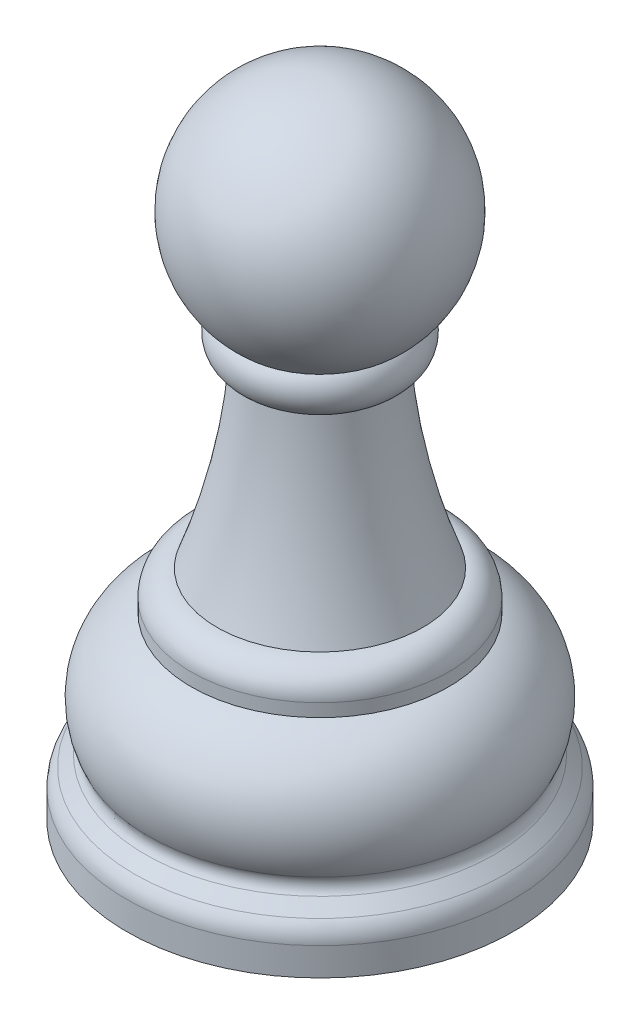
ISO-10303-21;
HEADER;
FILE_DESCRIPTION(('STEP AP214'),'2;1');
FILE_NAME('part.step','',(''),(''),'','','');
FILE_SCHEMA(('AUTOMOTIVE_DESIGN { 1 0 10303 214 1 1 1 1 }'));
ENDSEC;
DATA;
#1=APPLICATION_CONTEXT('core data for automotive mechanical design processes');
#2=APPLICATION_PROTOCOL_DEFINITION('international standard','automotive_design',2000,#1);
#3=PRODUCT_CONTEXT('',#1,'mechanical');
#4=PRODUCT('Part','Part','',(#3));
#5=PRODUCT_RELATED_PRODUCT_CATEGORY('part','',(#4));
#6=PRODUCT_DEFINITION_FORMATION('','',#4);
#7=PRODUCT_DEFINITION_CONTEXT('part definition',#1,'design');
#8=PRODUCT_DEFINITION('design','',#6,#7);
#9=PRODUCT_DEFINITION_SHAPE('','',#8);
#10=(LENGTH_UNIT() NAMED_UNIT(*) SI_UNIT(.MILLI.,.METRE.));
#11=(NAMED_UNIT(*) PLANE_ANGLE_UNIT() SI_UNIT($,.RADIAN.));
#12=(NAMED_UNIT(*) SI_UNIT($,.STERADIAN.) SOLID_ANGLE_UNIT());
#13=UNCERTAINTY_MEASURE_WITH_UNIT(LENGTH_MEASURE(1.E-05),#10,'distance_accuracy_value','');
#14=(GEOMETRIC_REPRESENTATION_CONTEXT(3) GLOBAL_UNCERTAINTY_ASSIGNED_CONTEXT((#13)) GLOBAL_UNIT_ASSIGNED_CONTEXT((#10,
#11,#12)) REPRESENTATION_CONTEXT('',''));
#15=CARTESIAN_POINT('',(0.,0.,0.));
#16=DIRECTION('',(0.,0.,1.));
#17=DIRECTION('',(1.,0.,0.));
#18=AXIS2_PLACEMENT_3D('',#15,#16,#17);
#19=CARTESIAN_POINT('',(-0.0701264216943996,-8.99972678946313,0.));
#20=DIRECTION('',(0.,0.,-1.));
#21=DIRECTION('',(-1.,0.,0.));
#22=AXIS2_PLACEMENT_3D('',#19,#20,#21);
#23=CIRCLE('',#22,9.);
#24=TRIMMED_CURVE('',#23,(PARAMETER_VALUE(-1.57858823027333)),
(PARAMETER_VALUE(1.57858823027333)),.T.,.PARAMETER.);
#25=CARTESIAN_POINT('',(0.,-8.99972678946313,0.));
#26=DIRECTION('',(0.,1.,0.));
#27=AXIS1_PLACEMENT('',#25,#26);
#28=SURFACE_OF_REVOLUTION('',#24,#27);
#29=CARTESIAN_POINT('',(0.,0.,0.));
#30=VERTEX_POINT('',#29);
#31=VERTEX_LOOP('',#30);
#32=FACE_BOUND('',#31,.T.);
#33=CARTESIAN_POINT('',(0.,-15.77,0.));
#34=DIRECTION('',(0.,1.,0.));
#35=DIRECTION('',(-1.,0.,0.));
#36=AXIS2_PLACEMENT_3D('',#33,#34,#35);
#37=CIRCLE('',#36,6.);
#38=CARTESIAN_POINT('',(-6.,-15.77,0.));
#39=VERTEX_POINT('',#38);
#40=EDGE_CURVE('E57',#39,#39,#37,.T.);
#41=ORIENTED_EDGE('',*,*,#40,.T.);
#42=EDGE_LOOP('',(#41));
#43=FACE_BOUND('',#42,.T.);
#44=ADVANCED_FACE('F41',(#32,#43),#28,.T.);
#45=CARTESIAN_POINT('',(15.,-50.,0.));
#46=DIRECTION('',(0.,1.,0.));
#47=DIRECTION('',(-1.,0.,0.));
#48=AXIS2_PLACEMENT_3D('',#45,#46,#47);
#49=PLANE('',#48);
#50=CARTESIAN_POINT('',(0.,-50.,0.));
#51=DIRECTION('',(0.,1.,0.));
#52=DIRECTION('',(-1.,0.,0.));
#53=AXIS2_PLACEMENT_3D('',#50,#51,#52);
#54=CIRCLE('',#53,15.);
#55=CARTESIAN_POINT('',(-15.,-50.,0.));
#56=VERTEX_POINT('',#55);
#57=EDGE_CURVE('E73',#56,#56,#54,.T.);
#58=ORIENTED_EDGE('',*,*,#57,.F.);
#59=EDGE_LOOP('',(#58));
#60=FACE_BOUND('',#59,.T.);
#61=ADVANCED_FACE('F53',(#60),#49,.F.);
#62=CARTESIAN_POINT('',(0.,0.,0.));
#63=DIRECTION('',(0.,1.,0.));
#64=DIRECTION('',(-1.,0.,0.));
#65=AXIS2_PLACEMENT_3D('',#62,#63,#64);
#66=CYLINDRICAL_SURFACE('',#65,15.);
#67=CARTESIAN_POINT('',(0.,-47.8284271247462,0.));
#68=DIRECTION('',(0.,-1.,0.));
#69=DIRECTION('',(1.,0.,0.));
#70=AXIS2_PLACEMENT_3D('',#67,#68,#69);
#71=CIRCLE('',#70,15.);
#72=CARTESIAN_POINT('',(15.,-47.8284271247462,0.));
#73=VERTEX_POINT('',#72);
#74=EDGE_CURVE('E79',#73,#73,#71,.T.);
#75=ORIENTED_EDGE('',*,*,#74,.T.);
#76=EDGE_LOOP('',(#75));
#77=FACE_BOUND('',#76,.T.);
#78=ORIENTED_EDGE('',*,*,#57,.T.);
#79=EDGE_LOOP('',(#78));
#80=FACE_BOUND('',#79,.T.);
#81=ADVANCED_FACE('F101',(#77,#80),#66,.T.);
#82=CARTESIAN_POINT('',(0.,-47.,0.));
#83=DIRECTION('',(0.,-1.,0.));
#84=DIRECTION('',(1.,0.,0.));
#85=AXIS2_PLACEMENT_3D('',#82,#83,#84);
#86=CONICAL_SURFACE('',#85,15.,0.78539816339745);
#87=CARTESIAN_POINT('',(0.,-45.5427154966001,0.));
#88=DIRECTION('',(0.,-1.,0.));
#89=DIRECTION('',(1.,0.,0.));
#90=AXIS2_PLACEMENT_3D('',#87,#88,#89);
#91=CIRCLE('',#90,13.5427154966002);
#92=CARTESIAN_POINT('',(13.5427154966002,-45.5427154966001,0.));
#93=VERTEX_POINT('',#92);
#94=EDGE_CURVE('E11',#93,#93,#91,.T.);
#95=ORIENTED_EDGE('',*,*,#94,.T.);
#96=EDGE_LOOP('',(#95));
#97=FACE_BOUND('',#96,.T.);
#98=CARTESIAN_POINT('',(0.,-46.4142135623731,0.));
#99=DIRECTION('',(0.,1.,0.));
#100=DIRECTION('',(-1.,0.,0.));
#101=AXIS2_PLACEMENT_3D('',#98,#99,#100);
#102=CIRCLE('',#101,14.4142135623731);
#103=CARTESIAN_POINT('',(-14.4142135623731,-46.4142135623731,0.));
#104=VERTEX_POINT('',#103);
#105=EDGE_CURVE('E76',#104,#104,#102,.T.);
#106=ORIENTED_EDGE('',*,*,#105,.T.);
#107=EDGE_LOOP('',(#106));
#108=FACE_BOUND('',#107,.T.);
#109=ADVANCED_FACE('F98',(#97,#108),#86,.T.);
#110=CARTESIAN_POINT('',(0.,-41.6855685618729,0.));
#111=DIRECTION('',(0.,1.,0.));
#112=DIRECTION('',(-1.,0.,0.));
#113=AXIS2_PLACEMENT_3D('',#110,#111,#112);
#114=TOROIDAL_SURFACE('',#113,8.,5.99878785739629);
#115=CARTESIAN_POINT('',(0.,-44.3855250412511,0.));
#116=DIRECTION('',(0.,1.,0.));
#117=DIRECTION('',(-1.,0.,0.));
#118=AXIS2_PLACEMENT_3D('',#115,#116,#117);
#119=CIRCLE('',#118,13.356835891411);
#120=CARTESIAN_POINT('',(-13.356835891411,-44.3855250412511,0.));
#121=VERTEX_POINT('',#120);
#122=EDGE_CURVE('E48',#121,#121,#119,.T.);
#123=ORIENTED_EDGE('',*,*,#122,.T.);
#124=EDGE_LOOP('',(#123));
#125=FACE_BOUND('',#124,.T.);
#126=CARTESIAN_POINT('',(0.,-36.03,0.));
#127=DIRECTION('',(0.,1.,0.));
#128=DIRECTION('',(-1.,0.,0.));
#129=AXIS2_PLACEMENT_3D('',#126,#127,#128);
#130=CIRCLE('',#129,10.);
#131=CARTESIAN_POINT('',(-9.99999999999999,-36.03,0.));
#132=VERTEX_POINT('',#131);
#133=EDGE_CURVE('E70',#132,#132,#130,.T.);
#134=ORIENTED_EDGE('',*,*,#133,.F.);
#135=EDGE_LOOP('',(#134));
#136=FACE_BOUND('',#135,.T.);
#137=ADVANCED_FACE('F84',(#125,#136),#114,.T.);
#138=CARTESIAN_POINT('',(0.,0.,0.));
#139=DIRECTION('',(0.,1.,0.));
#140=DIRECTION('',(-1.,0.,0.));
#141=AXIS2_PLACEMENT_3D('',#138,#139,#140);
#142=CYLINDRICAL_SURFACE('',#141,10.);
#143=CARTESIAN_POINT('',(0.,-35.03,0.));
#144=DIRECTION('',(0.,1.,0.));
#145=DIRECTION('',(-1.,0.,0.));
#146=AXIS2_PLACEMENT_3D('',#143,#144,#145);
#147=CIRCLE('',#146,10.);
#148=CARTESIAN_POINT('',(-10.,-35.03,0.));
#149=VERTEX_POINT('',#148);
#150=EDGE_CURVE('E67',#149,#149,#147,.T.);
#151=ORIENTED_EDGE('',*,*,#150,.F.);
#152=EDGE_LOOP('',(#151));
#153=FACE_BOUND('',#152,.T.);
#154=ORIENTED_EDGE('',*,*,#133,.T.);
#155=EDGE_LOOP('',(#154));
#156=FACE_BOUND('',#155,.T.);
#157=ADVANCED_FACE('F107',(#153,#156),#142,.T.);
#158=CARTESIAN_POINT('',(0.,-35.03,0.));
#159=DIRECTION('',(0.,1.,0.));
#160=DIRECTION('',(-1.,0.,0.));
#161=AXIS2_PLACEMENT_3D('',#158,#159,#160);
#162=TOROIDAL_SURFACE('',#161,8.00000000000001,1.99999999999999);
#163=CARTESIAN_POINT('',(0.,-33.03,0.));
#164=DIRECTION('',(0.,1.,0.));
#165=DIRECTION('',(-1.,0.,0.));
#166=AXIS2_PLACEMENT_3D('',#163,#164,#165);
#167=CIRCLE('',#166,8.);
#168=CARTESIAN_POINT('',(-8.,-33.03,0.));
#169=VERTEX_POINT('',#168);
#170=EDGE_CURVE('E62',#169,#169,#167,.T.);
#171=ORIENTED_EDGE('',*,*,#170,.F.);
#172=EDGE_LOOP('',(#171));
#173=FACE_BOUND('',#172,.T.);
#174=ORIENTED_EDGE('',*,*,#150,.T.);
#175=EDGE_LOOP('',(#174));
#176=FACE_BOUND('',#175,.T.);
#177=ADVANCED_FACE('F130',(#173,#176),#162,.T.);
#178=CARTESIAN_POINT('',(0.,-15.6614852770044,0.));
#179=DIRECTION('',(0.,1.,0.));
#180=DIRECTION('',(-1.,0.,0.));
#181=AXIS2_PLACEMENT_3D('',#178,#179,#180);
#182=TOROIDAL_SURFACE('',#181,54.8864020406459,50.);
#183=CARTESIAN_POINT('',(0.,-19.03,0.));
#184=DIRECTION('',(0.,1.,0.));
#185=DIRECTION('',(-1.,0.,0.));
#186=AXIS2_PLACEMENT_3D('',#183,#184,#185);
#187=CIRCLE('',#186,5.00000000000001);
#188=CARTESIAN_POINT('',(-5.00000000000001,-19.03,0.));
#189=VERTEX_POINT('',#188);
#190=EDGE_CURVE('E59',#189,#189,#187,.T.);
#191=ORIENTED_EDGE('',*,*,#190,.F.);
#192=EDGE_LOOP('',(#191));
#193=FACE_BOUND('',#192,.T.);
#194=ORIENTED_EDGE('',*,*,#170,.T.);
#195=EDGE_LOOP('',(#194));
#196=FACE_BOUND('',#195,.T.);
#197=ADVANCED_FACE('F139',(#193,#196),#182,.F.);
#198=CARTESIAN_POINT('',(0.,-17.093390995175,0.));
#199=DIRECTION('',(0.,1.,0.));
#200=DIRECTION('',(-1.,0.,0.));
#201=AXIS2_PLACEMENT_3D('',#198,#199,#200);
#202=TOROIDAL_SURFACE('',#201,4.50045464427059,2.);
#203=ORIENTED_EDGE('',*,*,#40,.F.);
#204=EDGE_LOOP('',(#203));
#205=FACE_BOUND('',#204,.T.);
#206=ORIENTED_EDGE('',*,*,#190,.T.);
#207=EDGE_LOOP('',(#206));
#208=FACE_BOUND('',#207,.T.);
#209=ADVANCED_FACE('F94',(#205,#208),#202,.T.);
#210=CARTESIAN_POINT('',(0.,-47.8284271247462,0.));
#211=DIRECTION('',(0.,-1.,0.));
#212=DIRECTION('',(1.,0.,0.));
#213=AXIS2_PLACEMENT_3D('',#210,#211,#212);
#214=TOROIDAL_SURFACE('',#213,13.,2.);
#215=ORIENTED_EDGE('',*,*,#74,.F.);
#216=EDGE_LOOP('',(#215));
#217=FACE_BOUND('',#216,.T.);
#218=ORIENTED_EDGE('',*,*,#105,.F.);
#219=EDGE_LOOP('',(#218));
#220=FACE_BOUND('',#219,.T.);
#221=ADVANCED_FACE('F88',(#217,#220),#214,.T.);
#222=CARTESIAN_POINT('',(0.,-44.8356087154136,0.));
#223=DIRECTION('',(0.,1.,0.));
#224=DIRECTION('',(-1.,0.,0.));
#225=AXIS2_PLACEMENT_3D('',#222,#223,#224);
#226=TOROIDAL_SURFACE('',#225,14.2498222777867,1.);
#227=ORIENTED_EDGE('',*,*,#94,.F.);
#228=EDGE_LOOP('',(#227));
#229=FACE_BOUND('',#228,.T.);
#230=ORIENTED_EDGE('',*,*,#122,.F.);
#231=EDGE_LOOP('',(#230));
#232=FACE_BOUND('',#231,.T.);
#233=ADVANCED_FACE('F43',(#229,#232),#226,.F.);
#234=CLOSED_SHELL('',(#44,#61,#81,#109,#137,#157,#177,#197,#209,#221,#233));
#235=MANIFOLD_SOLID_BREP('B2',#234);
#236=ADVANCED_BREP_SHAPE_REPRESENTATION('',(#18,#235),#14);
#237=SHAPE_DEFINITION_REPRESENTATION(#9,#236);
ENDSEC;
END-ISO-10303-21;
